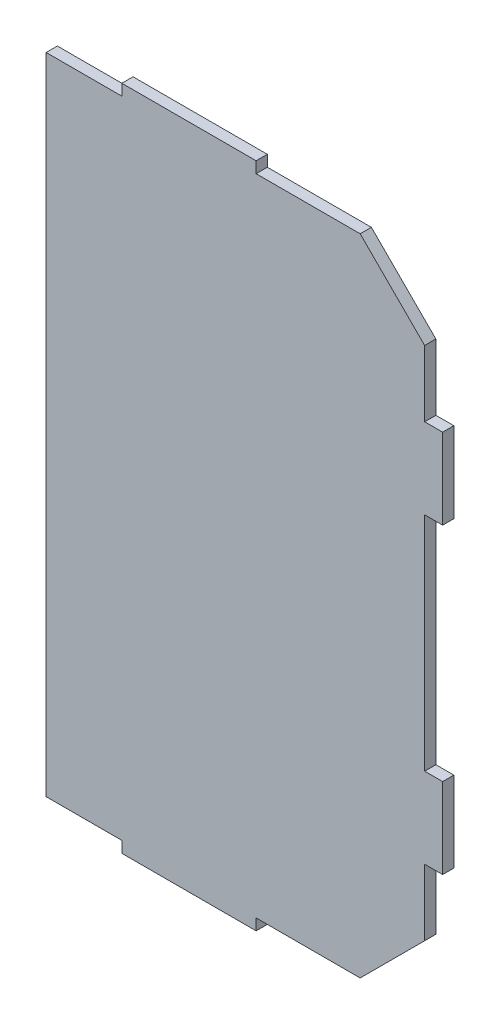
ISO-10303-21;
HEADER;
FILE_DESCRIPTION(('STEP AP214'),'2;1');
FILE_NAME('part.step','',(''),(''),'','','');
FILE_SCHEMA(('AUTOMOTIVE_DESIGN { 1 0 10303 214 1 1 1 1 }'));
ENDSEC;
DATA;
#1=APPLICATION_CONTEXT('core data for automotive mechanical design processes');
#2=APPLICATION_PROTOCOL_DEFINITION('international standard','automotive_design',2000,#1);
#3=PRODUCT_CONTEXT('',#1,'mechanical');
#4=PRODUCT('Part','Part','',(#3));
#5=PRODUCT_RELATED_PRODUCT_CATEGORY('part','',(#4));
#6=PRODUCT_DEFINITION_FORMATION('','',#4);
#7=PRODUCT_DEFINITION_CONTEXT('part definition',#1,'design');
#8=PRODUCT_DEFINITION('design','',#6,#7);
#9=PRODUCT_DEFINITION_SHAPE('','',#8);
#10=(LENGTH_UNIT() NAMED_UNIT(*) SI_UNIT(.MILLI.,.METRE.));
#11=(NAMED_UNIT(*) PLANE_ANGLE_UNIT() SI_UNIT($,.RADIAN.));
#12=(NAMED_UNIT(*) SI_UNIT($,.STERADIAN.) SOLID_ANGLE_UNIT());
#13=UNCERTAINTY_MEASURE_WITH_UNIT(LENGTH_MEASURE(1.E-05),#10,'distance_accuracy_value','');
#14=(GEOMETRIC_REPRESENTATION_CONTEXT(3) GLOBAL_UNCERTAINTY_ASSIGNED_CONTEXT((#13)) GLOBAL_UNIT_ASSIGNED_CONTEXT((#10,
#11,#12)) REPRESENTATION_CONTEXT('',''));
#15=CARTESIAN_POINT('',(0.,0.,0.));
#16=DIRECTION('',(0.,0.,1.));
#17=DIRECTION('',(1.,0.,0.));
#18=AXIS2_PLACEMENT_3D('',#15,#16,#17);
#19=CARTESIAN_POINT('',(-112.431652928551,-181.104658844913,10.6));
#20=DIRECTION('',(-1.,0.,0.));
#21=DIRECTION('',(0.,-1.,0.));
#22=AXIS2_PLACEMENT_3D('',#19,#20,#21);
#23=PLANE('',#22);
#24=DIRECTION('',(0.,1.,0.));
#25=VECTOR('',#24,1.);
#26=CARTESIAN_POINT('',(-112.431652928551,-181.104658844913,0.));
#27=LINE('',#26,#25);
#28=CARTESIAN_POINT('',(-112.431652928551,-243.800878167297,0.));
#29=VERTEX_POINT('',#28);
#30=CARTESIAN_POINT('',(-112.431652928551,-181.104658844913,0.));
#31=VERTEX_POINT('',#30);
#32=EDGE_CURVE('E387',#29,#31,#27,.T.);
#33=ORIENTED_EDGE('',*,*,#32,.T.);
#34=DIRECTION('',(0.,0.,-1.));
#35=VECTOR('',#34,1.);
#36=CARTESIAN_POINT('',(-112.431652928551,-181.104658844913,10.6));
#37=LINE('',#36,#35);
#38=CARTESIAN_POINT('',(-112.431652928551,-181.104658844913,10.6));
#39=VERTEX_POINT('',#38);
#40=EDGE_CURVE('E12',#39,#31,#37,.T.);
#41=ORIENTED_EDGE('',*,*,#40,.F.);
#42=DIRECTION('',(0.,1.,0.));
#43=VECTOR('',#42,1.);
#44=CARTESIAN_POINT('',(-112.431652928551,-181.104658844913,10.6));
#45=LINE('',#44,#43);
#46=CARTESIAN_POINT('',(-112.431652928551,-243.800878167297,10.6));
#47=VERTEX_POINT('',#46);
#48=EDGE_CURVE('E311',#47,#39,#45,.T.);
#49=ORIENTED_EDGE('',*,*,#48,.F.);
#50=DIRECTION('',(0.,0.,-1.));
#51=VECTOR('',#50,1.);
#52=CARTESIAN_POINT('',(-112.431652928551,-243.800878167297,10.6));
#53=LINE('',#52,#51);
#54=EDGE_CURVE('E219',#47,#29,#53,.T.);
#55=ORIENTED_EDGE('',*,*,#54,.T.);
#56=EDGE_LOOP('',(#33,#41,#49,#55));
#57=FACE_BOUND('',#56,.T.);
#58=ADVANCED_FACE('F40',(#57),#23,.F.);
#59=CARTESIAN_POINT('',(-95.4316529285508,-181.104658844913,10.6));
#60=DIRECTION('',(0.,1.,0.));
#61=DIRECTION('',(0.,0.,1.));
#62=AXIS2_PLACEMENT_3D('',#59,#60,#61);
#63=PLANE('',#62);
#64=DIRECTION('',(1.,0.,0.));
#65=VECTOR('',#64,1.);
#66=CARTESIAN_POINT('',(-95.4316529285508,-181.104658844913,0.));
#67=LINE('',#66,#65);
#68=CARTESIAN_POINT('',(-95.4316529285508,-181.104658844913,0.));
#69=VERTEX_POINT('',#68);
#70=EDGE_CURVE('E381',#31,#69,#67,.T.);
#71=ORIENTED_EDGE('',*,*,#70,.T.);
#72=DIRECTION('',(0.,0.,-1.));
#73=VECTOR('',#72,1.);
#74=CARTESIAN_POINT('',(-95.4316529285508,-181.104658844913,10.6));
#75=LINE('',#74,#73);
#76=CARTESIAN_POINT('',(-95.4316529285508,-181.104658844913,10.6));
#77=VERTEX_POINT('',#76);
#78=EDGE_CURVE('E48',#77,#69,#75,.T.);
#79=ORIENTED_EDGE('',*,*,#78,.F.);
#80=DIRECTION('',(1.,0.,0.));
#81=VECTOR('',#80,1.);
#82=CARTESIAN_POINT('',(-95.4316529285508,-181.104658844913,10.6));
#83=LINE('',#82,#81);
#84=EDGE_CURVE('E141',#39,#77,#83,.T.);
#85=ORIENTED_EDGE('',*,*,#84,.F.);
#86=ORIENTED_EDGE('',*,*,#40,.T.);
#87=EDGE_LOOP('',(#71,#79,#85,#86));
#88=FACE_BOUND('',#87,.T.);
#89=ADVANCED_FACE('F436',(#88),#63,.F.);
#90=CARTESIAN_POINT('',(-95.4316529285508,-104.904658844913,10.6));
#91=DIRECTION('',(-1.,0.,0.));
#92=DIRECTION('',(0.,0.,1.));
#93=AXIS2_PLACEMENT_3D('',#90,#91,#92);
#94=PLANE('',#93);
#95=DIRECTION('',(0.,1.,0.));
#96=VECTOR('',#95,1.);
#97=CARTESIAN_POINT('',(-95.4316529285508,-104.904658844913,0.));
#98=LINE('',#97,#96);
#99=CARTESIAN_POINT('',(-95.4316529285508,-104.904658844913,0.));
#100=VERTEX_POINT('',#99);
#101=EDGE_CURVE('E376',#69,#100,#98,.T.);
#102=ORIENTED_EDGE('',*,*,#101,.T.);
#103=DIRECTION('',(0.,0.,-1.));
#104=VECTOR('',#103,1.);
#105=CARTESIAN_POINT('',(-95.4316529285508,-104.904658844913,10.6));
#106=LINE('',#105,#104);
#107=CARTESIAN_POINT('',(-95.4316529285508,-104.904658844913,10.6));
#108=VERTEX_POINT('',#107);
#109=EDGE_CURVE('E368',#108,#100,#106,.T.);
#110=ORIENTED_EDGE('',*,*,#109,.F.);
#111=DIRECTION('',(0.,1.,0.));
#112=VECTOR('',#111,1.);
#113=CARTESIAN_POINT('',(-95.4316529285508,-104.904658844913,10.6));
#114=LINE('',#113,#112);
#115=EDGE_CURVE('E305',#77,#108,#114,.T.);
#116=ORIENTED_EDGE('',*,*,#115,.F.);
#117=ORIENTED_EDGE('',*,*,#78,.T.);
#118=EDGE_LOOP('',(#102,#110,#116,#117));
#119=FACE_BOUND('',#118,.T.);
#120=ADVANCED_FACE('F374',(#119),#94,.F.);
#121=CARTESIAN_POINT('',(-95.4316529285508,-104.904658844913,10.6));
#122=DIRECTION('',(0.,-1.,0.));
#123=DIRECTION('',(1.,0.,0.));
#124=AXIS2_PLACEMENT_3D('',#121,#122,#123);
#125=PLANE('',#124);
#126=DIRECTION('',(-1.,0.,0.));
#127=VECTOR('',#126,1.);
#128=CARTESIAN_POINT('',(-95.4316529285508,-104.904658844913,0.));
#129=LINE('',#128,#127);
#130=CARTESIAN_POINT('',(-112.431652928551,-104.904658844913,0.));
#131=VERTEX_POINT('',#130);
#132=EDGE_CURVE('E383',#100,#131,#129,.T.);
#133=ORIENTED_EDGE('',*,*,#132,.T.);
#134=DIRECTION('',(0.,0.,-1.));
#135=VECTOR('',#134,1.);
#136=CARTESIAN_POINT('',(-112.431652928551,-104.904658844913,10.6));
#137=LINE('',#136,#135);
#138=CARTESIAN_POINT('',(-112.431652928551,-104.904658844913,10.6));
#139=VERTEX_POINT('',#138);
#140=EDGE_CURVE('E365',#139,#131,#137,.T.);
#141=ORIENTED_EDGE('',*,*,#140,.F.);
#142=DIRECTION('',(-1.,0.,0.));
#143=VECTOR('',#142,1.);
#144=CARTESIAN_POINT('',(-95.4316529285508,-104.904658844913,10.6));
#145=LINE('',#144,#143);
#146=EDGE_CURVE('E297',#108,#139,#145,.T.);
#147=ORIENTED_EDGE('',*,*,#146,.F.);
#148=ORIENTED_EDGE('',*,*,#109,.T.);
#149=EDGE_LOOP('',(#133,#141,#147,#148));
#150=FACE_BOUND('',#149,.T.);
#151=ADVANCED_FACE('F443',(#150),#125,.F.);
#152=CARTESIAN_POINT('',(-112.431652928551,105.095341155087,10.6));
#153=DIRECTION('',(-1.,0.,0.));
#154=DIRECTION('',(0.,-1.,0.));
#155=AXIS2_PLACEMENT_3D('',#152,#153,#154);
#156=PLANE('',#155);
#157=DIRECTION('',(0.,1.,0.));
#158=VECTOR('',#157,1.);
#159=CARTESIAN_POINT('',(-112.431652928551,105.095341155087,0.));
#160=LINE('',#159,#158);
#161=CARTESIAN_POINT('',(-112.431652928551,105.095341155087,0.));
#162=VERTEX_POINT('',#161);
#163=EDGE_CURVE('E385',#131,#162,#160,.T.);
#164=ORIENTED_EDGE('',*,*,#163,.T.);
#165=DIRECTION('',(0.,0.,-1.));
#166=VECTOR('',#165,1.);
#167=CARTESIAN_POINT('',(-112.431652928551,105.095341155087,10.6));
#168=LINE('',#167,#166);
#169=CARTESIAN_POINT('',(-112.431652928551,105.095341155087,10.6));
#170=VERTEX_POINT('',#169);
#171=EDGE_CURVE('E362',#170,#162,#168,.T.);
#172=ORIENTED_EDGE('',*,*,#171,.F.);
#173=DIRECTION('',(0.,1.,0.));
#174=VECTOR('',#173,1.);
#175=CARTESIAN_POINT('',(-112.431652928551,105.095341155087,10.6));
#176=LINE('',#175,#174);
#177=EDGE_CURVE('E293',#139,#170,#176,.T.);
#178=ORIENTED_EDGE('',*,*,#177,.F.);
#179=ORIENTED_EDGE('',*,*,#140,.T.);
#180=EDGE_LOOP('',(#164,#172,#178,#179));
#181=FACE_BOUND('',#180,.T.);
#182=ADVANCED_FACE('F448',(#181),#156,.F.);
#183=CARTESIAN_POINT('',(-95.4316529285508,105.095341155087,10.6));
#184=DIRECTION('',(0.,1.,0.));
#185=DIRECTION('',(-1.,0.,0.));
#186=AXIS2_PLACEMENT_3D('',#183,#184,#185);
#187=PLANE('',#186);
#188=DIRECTION('',(1.,0.,0.));
#189=VECTOR('',#188,1.);
#190=CARTESIAN_POINT('',(-95.4316529285508,105.095341155087,0.));
#191=LINE('',#190,#189);
#192=CARTESIAN_POINT('',(-95.4316529285508,105.095341155087,0.));
#193=VERTEX_POINT('',#192);
#194=EDGE_CURVE('E391',#162,#193,#191,.T.);
#195=ORIENTED_EDGE('',*,*,#194,.T.);
#196=DIRECTION('',(0.,0.,-1.));
#197=VECTOR('',#196,1.);
#198=CARTESIAN_POINT('',(-95.4316529285508,105.095341155087,10.6));
#199=LINE('',#198,#197);
#200=CARTESIAN_POINT('',(-95.4316529285508,105.095341155087,10.6));
#201=VERTEX_POINT('',#200);
#202=EDGE_CURVE('E359',#201,#193,#199,.T.);
#203=ORIENTED_EDGE('',*,*,#202,.F.);
#204=DIRECTION('',(1.,0.,0.));
#205=VECTOR('',#204,1.);
#206=CARTESIAN_POINT('',(-95.4316529285508,105.095341155087,10.6));
#207=LINE('',#206,#205);
#208=EDGE_CURVE('E289',#170,#201,#207,.T.);
#209=ORIENTED_EDGE('',*,*,#208,.F.);
#210=ORIENTED_EDGE('',*,*,#171,.T.);
#211=EDGE_LOOP('',(#195,#203,#209,#210));
#212=FACE_BOUND('',#211,.T.);
#213=ADVANCED_FACE('F452',(#212),#187,.F.);
#214=CARTESIAN_POINT('',(-95.4316529285508,181.295341155087,10.6));
#215=DIRECTION('',(-1.,0.,0.));
#216=DIRECTION('',(0.,-1.,0.));
#217=AXIS2_PLACEMENT_3D('',#214,#215,#216);
#218=PLANE('',#217);
#219=DIRECTION('',(0.,1.,0.));
#220=VECTOR('',#219,1.);
#221=CARTESIAN_POINT('',(-95.4316529285508,181.295341155087,0.));
#222=LINE('',#221,#220);
#223=CARTESIAN_POINT('',(-95.4316529285508,181.295341155087,0.));
#224=VERTEX_POINT('',#223);
#225=EDGE_CURVE('E393',#193,#224,#222,.T.);
#226=ORIENTED_EDGE('',*,*,#225,.T.);
#227=DIRECTION('',(0.,0.,-1.));
#228=VECTOR('',#227,1.);
#229=CARTESIAN_POINT('',(-95.4316529285508,181.295341155087,10.6));
#230=LINE('',#229,#228);
#231=CARTESIAN_POINT('',(-95.4316529285508,181.295341155087,10.6));
#232=VERTEX_POINT('',#231);
#233=EDGE_CURVE('E356',#232,#224,#230,.T.);
#234=ORIENTED_EDGE('',*,*,#233,.F.);
#235=DIRECTION('',(0.,1.,0.));
#236=VECTOR('',#235,1.);
#237=CARTESIAN_POINT('',(-95.4316529285508,181.295341155087,10.6));
#238=LINE('',#237,#236);
#239=EDGE_CURVE('E286',#201,#232,#238,.T.);
#240=ORIENTED_EDGE('',*,*,#239,.F.);
#241=ORIENTED_EDGE('',*,*,#202,.T.);
#242=EDGE_LOOP('',(#226,#234,#240,#241));
#243=FACE_BOUND('',#242,.T.);
#244=ADVANCED_FACE('F456',(#243),#218,.F.);
#245=CARTESIAN_POINT('',(-95.4316529285508,181.295341155087,10.6));
#246=DIRECTION('',(0.,-1.,0.));
#247=DIRECTION('',(0.,0.,-1.));
#248=AXIS2_PLACEMENT_3D('',#245,#246,#247);
#249=PLANE('',#248);
#250=DIRECTION('',(-1.,0.,0.));
#251=VECTOR('',#250,1.);
#252=CARTESIAN_POINT('',(-95.4316529285508,181.295341155087,0.));
#253=LINE('',#252,#251);
#254=CARTESIAN_POINT('',(-112.431652928551,181.295341155087,0.));
#255=VERTEX_POINT('',#254);
#256=EDGE_CURVE('E395',#224,#255,#253,.T.);
#257=ORIENTED_EDGE('',*,*,#256,.T.);
#258=DIRECTION('',(0.,0.,-1.));
#259=VECTOR('',#258,1.);
#260=CARTESIAN_POINT('',(-112.431652928551,181.295341155087,10.6));
#261=LINE('',#260,#259);
#262=CARTESIAN_POINT('',(-112.431652928551,181.295341155087,10.6));
#263=VERTEX_POINT('',#262);
#264=EDGE_CURVE('E353',#263,#255,#261,.T.);
#265=ORIENTED_EDGE('',*,*,#264,.F.);
#266=DIRECTION('',(-1.,0.,0.));
#267=VECTOR('',#266,1.);
#268=CARTESIAN_POINT('',(-95.4316529285508,181.295341155087,10.6));
#269=LINE('',#268,#267);
#270=EDGE_CURVE('E278',#232,#263,#269,.T.);
#271=ORIENTED_EDGE('',*,*,#270,.F.);
#272=ORIENTED_EDGE('',*,*,#233,.T.);
#273=EDGE_LOOP('',(#257,#265,#271,#272));
#274=FACE_BOUND('',#273,.T.);
#275=ADVANCED_FACE('F460',(#274),#249,.F.);
#276=CARTESIAN_POINT('',(-112.431652928551,243.800878167298,10.6));
#277=DIRECTION('',(-1.,0.,0.));
#278=DIRECTION('',(0.,-1.,0.));
#279=AXIS2_PLACEMENT_3D('',#276,#277,#278);
#280=PLANE('',#279);
#281=DIRECTION('',(0.,1.,0.));
#282=VECTOR('',#281,1.);
#283=CARTESIAN_POINT('',(-112.431652928551,243.800878167298,0.));
#284=LINE('',#283,#282);
#285=CARTESIAN_POINT('',(-112.431652928551,243.800878167298,0.));
#286=VERTEX_POINT('',#285);
#287=EDGE_CURVE('E397',#255,#286,#284,.T.);
#288=ORIENTED_EDGE('',*,*,#287,.T.);
#289=DIRECTION('',(0.,0.,-1.));
#290=VECTOR('',#289,1.);
#291=CARTESIAN_POINT('',(-112.431652928551,243.800878167298,10.6));
#292=LINE('',#291,#290);
#293=CARTESIAN_POINT('',(-112.431652928551,243.800878167298,10.6));
#294=VERTEX_POINT('',#293);
#295=EDGE_CURVE('E350',#294,#286,#292,.T.);
#296=ORIENTED_EDGE('',*,*,#295,.F.);
#297=DIRECTION('',(0.,1.,0.));
#298=VECTOR('',#297,1.);
#299=CARTESIAN_POINT('',(-112.431652928551,243.800878167298,10.6));
#300=LINE('',#299,#298);
#301=EDGE_CURVE('E274',#263,#294,#300,.T.);
#302=ORIENTED_EDGE('',*,*,#301,.F.);
#303=ORIENTED_EDGE('',*,*,#264,.T.);
#304=EDGE_LOOP('',(#288,#296,#302,#303));
#305=FACE_BOUND('',#304,.T.);
#306=ADVANCED_FACE('F464',(#305),#280,.F.);
#307=CARTESIAN_POINT('',(-173.430774761253,304.8,10.6));
#308=DIRECTION('',(-0.707106781186547,-0.707106781186548,0.));
#309=DIRECTION('',(0.707106781186548,-0.707106781186547,0.));
#310=AXIS2_PLACEMENT_3D('',#307,#308,#309);
#311=PLANE('',#310);
#312=DIRECTION('',(-0.707106781186548,0.707106781186547,0.));
#313=VECTOR('',#312,1.);
#314=CARTESIAN_POINT('',(-173.430774761253,304.8,0.));
#315=LINE('',#314,#313);
#316=CARTESIAN_POINT('',(-173.430774761253,304.8,0.));
#317=VERTEX_POINT('',#316);
#318=EDGE_CURVE('E399',#286,#317,#315,.T.);
#319=ORIENTED_EDGE('',*,*,#318,.T.);
#320=DIRECTION('',(0.,0.,-1.));
#321=VECTOR('',#320,1.);
#322=CARTESIAN_POINT('',(-173.430774761253,304.8,10.6));
#323=LINE('',#322,#321);
#324=CARTESIAN_POINT('',(-173.430774761253,304.8,10.6));
#325=VERTEX_POINT('',#324);
#326=EDGE_CURVE('E347',#325,#317,#323,.T.);
#327=ORIENTED_EDGE('',*,*,#326,.F.);
#328=DIRECTION('',(-0.707106781186548,0.707106781186547,0.));
#329=VECTOR('',#328,1.);
#330=CARTESIAN_POINT('',(-173.430774761253,304.8,10.6));
#331=LINE('',#330,#329);
#332=EDGE_CURVE('E270',#294,#325,#331,.T.);
#333=ORIENTED_EDGE('',*,*,#332,.F.);
#334=ORIENTED_EDGE('',*,*,#295,.T.);
#335=EDGE_LOOP('',(#319,#327,#333,#334));
#336=FACE_BOUND('',#335,.T.);
#337=ADVANCED_FACE('F468',(#336),#311,.F.);
#338=CARTESIAN_POINT('',(-173.430774761253,304.8,10.6));
#339=DIRECTION('',(0.,-1.,0.));
#340=DIRECTION('',(1.,0.,0.));
#341=AXIS2_PLACEMENT_3D('',#338,#339,#340);
#342=PLANE('',#341);
#343=DIRECTION('',(-1.,0.,0.));
#344=VECTOR('',#343,1.);
#345=CARTESIAN_POINT('',(-173.430774761253,304.8,0.));
#346=LINE('',#345,#344);
#347=CARTESIAN_POINT('',(-271.838092179976,304.800000000001,0.));
#348=VERTEX_POINT('',#347);
#349=EDGE_CURVE('E401',#317,#348,#346,.T.);
#350=ORIENTED_EDGE('',*,*,#349,.T.);
#351=DIRECTION('',(0.,0.,-1.));
#352=VECTOR('',#351,1.);
#353=CARTESIAN_POINT('',(-271.838092179976,304.800000000001,10.6));
#354=LINE('',#353,#352);
#355=CARTESIAN_POINT('',(-271.838092179976,304.800000000001,10.6));
#356=VERTEX_POINT('',#355);
#357=EDGE_CURVE('E344',#356,#348,#354,.T.);
#358=ORIENTED_EDGE('',*,*,#357,.F.);
#359=DIRECTION('',(-1.,0.,0.));
#360=VECTOR('',#359,1.);
#361=CARTESIAN_POINT('',(-173.430774761253,304.8,10.6));
#362=LINE('',#361,#360);
#363=EDGE_CURVE('E267',#325,#356,#362,.T.);
#364=ORIENTED_EDGE('',*,*,#363,.F.);
#365=ORIENTED_EDGE('',*,*,#326,.T.);
#366=EDGE_LOOP('',(#350,#358,#364,#365));
#367=FACE_BOUND('',#366,.T.);
#368=ADVANCED_FACE('F472',(#367),#342,.F.);
#369=CARTESIAN_POINT('',(-271.838092179976,304.800000000001,10.6));
#370=DIRECTION('',(-1.,0.,0.));
#371=DIRECTION('',(0.,0.,1.));
#372=AXIS2_PLACEMENT_3D('',#369,#370,#371);
#373=PLANE('',#372);
#374=DIRECTION('',(0.,1.,0.));
#375=VECTOR('',#374,1.);
#376=CARTESIAN_POINT('',(-271.838092179976,304.800000000001,0.));
#377=LINE('',#376,#375);
#378=CARTESIAN_POINT('',(-271.838092179976,315.4,0.));
#379=VERTEX_POINT('',#378);
#380=EDGE_CURVE('E403',#348,#379,#377,.T.);
#381=ORIENTED_EDGE('',*,*,#380,.T.);
#382=DIRECTION('',(0.,0.,-1.));
#383=VECTOR('',#382,1.);
#384=CARTESIAN_POINT('',(-271.838092179976,315.4,10.6));
#385=LINE('',#384,#383);
#386=CARTESIAN_POINT('',(-271.838092179976,315.4,10.6));
#387=VERTEX_POINT('',#386);
#388=EDGE_CURVE('E341',#387,#379,#385,.T.);
#389=ORIENTED_EDGE('',*,*,#388,.F.);
#390=DIRECTION('',(0.,1.,0.));
#391=VECTOR('',#390,1.);
#392=CARTESIAN_POINT('',(-271.838092179976,304.800000000001,10.6));
#393=LINE('',#392,#391);
#394=EDGE_CURVE('E259',#356,#387,#393,.T.);
#395=ORIENTED_EDGE('',*,*,#394,.F.);
#396=ORIENTED_EDGE('',*,*,#357,.T.);
#397=EDGE_LOOP('',(#381,#389,#395,#396));
#398=FACE_BOUND('',#397,.T.);
#399=ADVANCED_FACE('F476',(#398),#373,.F.);
#400=CARTESIAN_POINT('',(-398.838092179976,315.4,10.6));
#401=DIRECTION('',(0.,-1.,0.));
#402=DIRECTION('',(0.,0.,-1.));
#403=AXIS2_PLACEMENT_3D('',#400,#401,#402);
#404=PLANE('',#403);
#405=DIRECTION('',(-1.,0.,0.));
#406=VECTOR('',#405,1.);
#407=CARTESIAN_POINT('',(-398.838092179976,315.4,0.));
#408=LINE('',#407,#406);
#409=CARTESIAN_POINT('',(-398.838092179976,315.4,0.));
#410=VERTEX_POINT('',#409);
#411=EDGE_CURVE('E405',#379,#410,#408,.T.);
#412=ORIENTED_EDGE('',*,*,#411,.T.);
#413=DIRECTION('',(0.,0.,-1.));
#414=VECTOR('',#413,1.);
#415=CARTESIAN_POINT('',(-398.838092179976,315.4,10.6));
#416=LINE('',#415,#414);
#417=CARTESIAN_POINT('',(-398.838092179976,315.4,10.6));
#418=VERTEX_POINT('',#417);
#419=EDGE_CURVE('E338',#418,#410,#416,.T.);
#420=ORIENTED_EDGE('',*,*,#419,.F.);
#421=DIRECTION('',(-1.,0.,0.));
#422=VECTOR('',#421,1.);
#423=CARTESIAN_POINT('',(-398.838092179976,315.4,10.6));
#424=LINE('',#423,#422);
#425=EDGE_CURVE('E255',#387,#418,#424,.T.);
#426=ORIENTED_EDGE('',*,*,#425,.F.);
#427=ORIENTED_EDGE('',*,*,#388,.T.);
#428=EDGE_LOOP('',(#412,#420,#426,#427));
#429=FACE_BOUND('',#428,.T.);
#430=ADVANCED_FACE('F480',(#429),#404,.F.);
#431=CARTESIAN_POINT('',(-398.838092179976,304.8,10.6));
#432=DIRECTION('',(1.,0.,0.));
#433=DIRECTION('',(0.,0.,-1.));
#434=AXIS2_PLACEMENT_3D('',#431,#432,#433);
#435=PLANE('',#434);
#436=DIRECTION('',(0.,-1.,0.));
#437=VECTOR('',#436,1.);
#438=CARTESIAN_POINT('',(-398.838092179976,304.8,0.));
#439=LINE('',#438,#437);
#440=CARTESIAN_POINT('',(-398.838092179976,304.8,0.));
#441=VERTEX_POINT('',#440);
#442=EDGE_CURVE('E407',#410,#441,#439,.T.);
#443=ORIENTED_EDGE('',*,*,#442,.T.);
#444=DIRECTION('',(0.,0.,-1.));
#445=VECTOR('',#444,1.);
#446=CARTESIAN_POINT('',(-398.838092179976,304.8,10.6));
#447=LINE('',#446,#445);
#448=CARTESIAN_POINT('',(-398.838092179976,304.8,10.6));
#449=VERTEX_POINT('',#448);
#450=EDGE_CURVE('E335',#449,#441,#447,.T.);
#451=ORIENTED_EDGE('',*,*,#450,.F.);
#452=DIRECTION('',(0.,-1.,0.));
#453=VECTOR('',#452,1.);
#454=CARTESIAN_POINT('',(-398.838092179976,304.8,10.6));
#455=LINE('',#454,#453);
#456=EDGE_CURVE('E251',#418,#449,#455,.T.);
#457=ORIENTED_EDGE('',*,*,#456,.F.);
#458=ORIENTED_EDGE('',*,*,#419,.T.);
#459=EDGE_LOOP('',(#443,#451,#457,#458));
#460=FACE_BOUND('',#459,.T.);
#461=ADVANCED_FACE('F484',(#460),#435,.F.);
#462=CARTESIAN_POINT('',(-398.838092179976,304.8,10.6));
#463=DIRECTION('',(0.,-1.,0.));
#464=DIRECTION('',(0.,0.,-1.));
#465=AXIS2_PLACEMENT_3D('',#462,#463,#464);
#466=PLANE('',#465);
#467=DIRECTION('',(-1.,0.,0.));
#468=VECTOR('',#467,1.);
#469=CARTESIAN_POINT('',(-398.838092179976,304.8,0.));
#470=LINE('',#469,#468);
#471=CARTESIAN_POINT('',(-470.431652928551,304.8,0.));
#472=VERTEX_POINT('',#471);
#473=EDGE_CURVE('E409',#441,#472,#470,.T.);
#474=ORIENTED_EDGE('',*,*,#473,.T.);
#475=DIRECTION('',(0.,0.,-1.));
#476=VECTOR('',#475,1.);
#477=CARTESIAN_POINT('',(-470.431652928551,304.8,10.6));
#478=LINE('',#477,#476);
#479=CARTESIAN_POINT('',(-470.431652928551,304.8,10.6));
#480=VERTEX_POINT('',#479);
#481=EDGE_CURVE('E332',#480,#472,#478,.T.);
#482=ORIENTED_EDGE('',*,*,#481,.F.);
#483=DIRECTION('',(-1.,0.,0.));
#484=VECTOR('',#483,1.);
#485=CARTESIAN_POINT('',(-398.838092179976,304.8,10.6));
#486=LINE('',#485,#484);
#487=EDGE_CURVE('E248',#449,#480,#486,.T.);
#488=ORIENTED_EDGE('',*,*,#487,.F.);
#489=ORIENTED_EDGE('',*,*,#450,.T.);
#490=EDGE_LOOP('',(#474,#482,#488,#489));
#491=FACE_BOUND('',#490,.T.);
#492=ADVANCED_FACE('F488',(#491),#466,.F.);
#493=CARTESIAN_POINT('',(-470.431652928551,304.8,10.6));
#494=DIRECTION('',(1.,0.,0.));
#495=DIRECTION('',(0.,1.,0.));
#496=AXIS2_PLACEMENT_3D('',#493,#494,#495);
#497=PLANE('',#496);
#498=DIRECTION('',(0.,-1.,0.));
#499=VECTOR('',#498,1.);
#500=CARTESIAN_POINT('',(-470.431652928551,304.8,0.));
#501=LINE('',#500,#499);
#502=CARTESIAN_POINT('',(-470.431652928551,-304.8,0.));
#503=VERTEX_POINT('',#502);
#504=EDGE_CURVE('E411',#472,#503,#501,.T.);
#505=ORIENTED_EDGE('',*,*,#504,.T.);
#506=DIRECTION('',(0.,0.,-1.));
#507=VECTOR('',#506,1.);
#508=CARTESIAN_POINT('',(-470.431652928551,-304.8,10.6));
#509=LINE('',#508,#507);
#510=CARTESIAN_POINT('',(-470.431652928551,-304.8,10.6));
#511=VERTEX_POINT('',#510);
#512=EDGE_CURVE('E329',#511,#503,#509,.T.);
#513=ORIENTED_EDGE('',*,*,#512,.F.);
#514=DIRECTION('',(0.,-1.,0.));
#515=VECTOR('',#514,1.);
#516=CARTESIAN_POINT('',(-470.431652928551,304.8,10.6));
#517=LINE('',#516,#515);
#518=EDGE_CURVE('E240',#480,#511,#517,.T.);
#519=ORIENTED_EDGE('',*,*,#518,.F.);
#520=ORIENTED_EDGE('',*,*,#481,.T.);
#521=EDGE_LOOP('',(#505,#513,#519,#520));
#522=FACE_BOUND('',#521,.T.);
#523=ADVANCED_FACE('F492',(#522),#497,.F.);
#524=CARTESIAN_POINT('',(-470.431652928551,-304.8,10.6));
#525=DIRECTION('',(0.,1.,0.));
#526=DIRECTION('',(0.,0.,1.));
#527=AXIS2_PLACEMENT_3D('',#524,#525,#526);
#528=PLANE('',#527);
#529=DIRECTION('',(1.,0.,0.));
#530=VECTOR('',#529,1.);
#531=CARTESIAN_POINT('',(-470.431652928551,-304.8,0.));
#532=LINE('',#531,#530);
#533=CARTESIAN_POINT('',(-398.838092179976,-304.8,0.));
#534=VERTEX_POINT('',#533);
#535=EDGE_CURVE('E413',#503,#534,#532,.T.);
#536=ORIENTED_EDGE('',*,*,#535,.T.);
#537=DIRECTION('',(0.,0.,-1.));
#538=VECTOR('',#537,1.);
#539=CARTESIAN_POINT('',(-398.838092179976,-304.8,10.6));
#540=LINE('',#539,#538);
#541=CARTESIAN_POINT('',(-398.838092179976,-304.8,10.6));
#542=VERTEX_POINT('',#541);
#543=EDGE_CURVE('E326',#542,#534,#540,.T.);
#544=ORIENTED_EDGE('',*,*,#543,.F.);
#545=DIRECTION('',(1.,0.,0.));
#546=VECTOR('',#545,1.);
#547=CARTESIAN_POINT('',(-470.431652928551,-304.8,10.6));
#548=LINE('',#547,#546);
#549=EDGE_CURVE('E236',#511,#542,#548,.T.);
#550=ORIENTED_EDGE('',*,*,#549,.F.);
#551=ORIENTED_EDGE('',*,*,#512,.T.);
#552=EDGE_LOOP('',(#536,#544,#550,#551));
#553=FACE_BOUND('',#552,.T.);
#554=ADVANCED_FACE('F496',(#553),#528,.F.);
#555=CARTESIAN_POINT('',(-398.838092179976,-315.4,10.6));
#556=DIRECTION('',(1.,0.,0.));
#557=DIRECTION('',(0.,0.,-1.));
#558=AXIS2_PLACEMENT_3D('',#555,#556,#557);
#559=PLANE('',#558);
#560=DIRECTION('',(0.,-1.,0.));
#561=VECTOR('',#560,1.);
#562=CARTESIAN_POINT('',(-398.838092179976,-315.4,0.));
#563=LINE('',#562,#561);
#564=CARTESIAN_POINT('',(-398.838092179976,-315.4,0.));
#565=VERTEX_POINT('',#564);
#566=EDGE_CURVE('E415',#534,#565,#563,.T.);
#567=ORIENTED_EDGE('',*,*,#566,.T.);
#568=DIRECTION('',(0.,0.,-1.));
#569=VECTOR('',#568,1.);
#570=CARTESIAN_POINT('',(-398.838092179976,-315.4,10.6));
#571=LINE('',#570,#569);
#572=CARTESIAN_POINT('',(-398.838092179976,-315.4,10.6));
#573=VERTEX_POINT('',#572);
#574=EDGE_CURVE('E323',#573,#565,#571,.T.);
#575=ORIENTED_EDGE('',*,*,#574,.F.);
#576=DIRECTION('',(0.,-1.,0.));
#577=VECTOR('',#576,1.);
#578=CARTESIAN_POINT('',(-398.838092179976,-315.4,10.6));
#579=LINE('',#578,#577);
#580=EDGE_CURVE('E232',#542,#573,#579,.T.);
#581=ORIENTED_EDGE('',*,*,#580,.F.);
#582=ORIENTED_EDGE('',*,*,#543,.T.);
#583=EDGE_LOOP('',(#567,#575,#581,#582));
#584=FACE_BOUND('',#583,.T.);
#585=ADVANCED_FACE('F500',(#584),#559,.F.);
#586=CARTESIAN_POINT('',(-398.838092179976,-315.4,10.6));
#587=DIRECTION('',(0.,1.,0.));
#588=DIRECTION('',(0.,0.,1.));
#589=AXIS2_PLACEMENT_3D('',#586,#587,#588);
#590=PLANE('',#589);
#591=DIRECTION('',(1.,0.,0.));
#592=VECTOR('',#591,1.);
#593=CARTESIAN_POINT('',(-398.838092179976,-315.4,0.));
#594=LINE('',#593,#592);
#595=CARTESIAN_POINT('',(-271.838092179976,-315.4,0.));
#596=VERTEX_POINT('',#595);
#597=EDGE_CURVE('E417',#565,#596,#594,.T.);
#598=ORIENTED_EDGE('',*,*,#597,.T.);
#599=DIRECTION('',(0.,0.,-1.));
#600=VECTOR('',#599,1.);
#601=CARTESIAN_POINT('',(-271.838092179976,-315.4,10.6));
#602=LINE('',#601,#600);
#603=CARTESIAN_POINT('',(-271.838092179976,-315.4,10.6));
#604=VERTEX_POINT('',#603);
#605=EDGE_CURVE('E212',#604,#596,#602,.T.);
#606=ORIENTED_EDGE('',*,*,#605,.F.);
#607=DIRECTION('',(1.,0.,0.));
#608=VECTOR('',#607,1.);
#609=CARTESIAN_POINT('',(-398.838092179976,-315.4,10.6));
#610=LINE('',#609,#608);
#611=EDGE_CURVE('E202',#573,#604,#610,.T.);
#612=ORIENTED_EDGE('',*,*,#611,.F.);
#613=ORIENTED_EDGE('',*,*,#574,.T.);
#614=EDGE_LOOP('',(#598,#606,#612,#613));
#615=FACE_BOUND('',#614,.T.);
#616=ADVANCED_FACE('F420',(#615),#590,.F.);
#617=CARTESIAN_POINT('',(-271.838092179976,-315.4,10.6));
#618=DIRECTION('',(-1.,0.,0.));
#619=DIRECTION('',(0.,0.,1.));
#620=AXIS2_PLACEMENT_3D('',#617,#618,#619);
#621=PLANE('',#620);
#622=DIRECTION('',(0.,1.,0.));
#623=VECTOR('',#622,1.);
#624=CARTESIAN_POINT('',(-271.838092179976,-315.4,0.));
#625=LINE('',#624,#623);
#626=CARTESIAN_POINT('',(-271.838092179976,-304.8,0.));
#627=VERTEX_POINT('',#626);
#628=EDGE_CURVE('E211',#596,#627,#625,.T.);
#629=ORIENTED_EDGE('',*,*,#628,.T.);
#630=DIRECTION('',(0.,0.,-1.));
#631=VECTOR('',#630,1.);
#632=CARTESIAN_POINT('',(-271.838092179976,-304.8,10.6));
#633=LINE('',#632,#631);
#634=CARTESIAN_POINT('',(-271.838092179976,-304.8,10.6));
#635=VERTEX_POINT('',#634);
#636=EDGE_CURVE('E208',#635,#627,#633,.T.);
#637=ORIENTED_EDGE('',*,*,#636,.F.);
#638=DIRECTION('',(0.,1.,0.));
#639=VECTOR('',#638,1.);
#640=CARTESIAN_POINT('',(-271.838092179976,-315.4,10.6));
#641=LINE('',#640,#639);
#642=EDGE_CURVE('E196',#604,#635,#641,.T.);
#643=ORIENTED_EDGE('',*,*,#642,.F.);
#644=ORIENTED_EDGE('',*,*,#605,.T.);
#645=EDGE_LOOP('',(#629,#637,#643,#644));
#646=FACE_BOUND('',#645,.T.);
#647=ADVANCED_FACE('F209',(#646),#621,.F.);
#648=CARTESIAN_POINT('',(-173.430774761254,-304.8,10.6));
#649=DIRECTION('',(0.,1.,0.));
#650=DIRECTION('',(0.,0.,1.));
#651=AXIS2_PLACEMENT_3D('',#648,#649,#650);
#652=PLANE('',#651);
#653=DIRECTION('',(1.,0.,0.));
#654=VECTOR('',#653,1.);
#655=CARTESIAN_POINT('',(-173.430774761254,-304.8,0.));
#656=LINE('',#655,#654);
#657=CARTESIAN_POINT('',(-173.430774761254,-304.8,0.));
#658=VERTEX_POINT('',#657);
#659=EDGE_CURVE('E127',#627,#658,#656,.T.);
#660=ORIENTED_EDGE('',*,*,#659,.T.);
#661=DIRECTION('',(0.,0.,-1.));
#662=VECTOR('',#661,1.);
#663=CARTESIAN_POINT('',(-173.430774761254,-304.8,10.6));
#664=LINE('',#663,#662);
#665=CARTESIAN_POINT('',(-173.430774761254,-304.8,10.6));
#666=VERTEX_POINT('',#665);
#667=EDGE_CURVE('E213',#666,#658,#664,.T.);
#668=ORIENTED_EDGE('',*,*,#667,.F.);
#669=DIRECTION('',(1.,0.,0.));
#670=VECTOR('',#669,1.);
#671=CARTESIAN_POINT('',(-173.430774761254,-304.8,10.6));
#672=LINE('',#671,#670);
#673=EDGE_CURVE('E200',#635,#666,#672,.T.);
#674=ORIENTED_EDGE('',*,*,#673,.F.);
#675=ORIENTED_EDGE('',*,*,#636,.T.);
#676=EDGE_LOOP('',(#660,#668,#674,#675));
#677=FACE_BOUND('',#676,.T.);
#678=ADVANCED_FACE('F215',(#677),#652,.F.);
#679=CARTESIAN_POINT('',(-173.430774761254,-304.8,10.6));
#680=DIRECTION('',(-0.707106781186549,0.707106781186546,0.));
#681=DIRECTION('',(-0.707106781186546,-0.707106781186549,0.));
#682=AXIS2_PLACEMENT_3D('',#679,#680,#681);
#683=PLANE('',#682);
#684=DIRECTION('',(0.707106781186546,0.707106781186549,0.));
#685=VECTOR('',#684,1.);
#686=CARTESIAN_POINT('',(-173.430774761254,-304.8,0.));
#687=LINE('',#686,#685);
#688=EDGE_CURVE('E133',#658,#29,#687,.T.);
#689=ORIENTED_EDGE('',*,*,#688,.T.);
#690=ORIENTED_EDGE('',*,*,#54,.F.);
#691=DIRECTION('',(0.707106781186546,0.707106781186549,0.));
#692=VECTOR('',#691,1.);
#693=CARTESIAN_POINT('',(-173.430774761254,-304.8,10.6));
#694=LINE('',#693,#692);
#695=EDGE_CURVE('E56',#666,#47,#694,.T.);
#696=ORIENTED_EDGE('',*,*,#695,.F.);
#697=ORIENTED_EDGE('',*,*,#667,.T.);
#698=EDGE_LOOP('',(#689,#690,#696,#697));
#699=FACE_BOUND('',#698,.T.);
#700=ADVANCED_FACE('F425',(#699),#683,.F.);
#701=CARTESIAN_POINT('',(0.,0.,10.6));
#702=DIRECTION('',(0.,0.,-1.));
#703=DIRECTION('',(-1.,0.,0.));
#704=AXIS2_PLACEMENT_3D('',#701,#702,#703);
#705=PLANE('',#704);
#706=ORIENTED_EDGE('',*,*,#48,.T.);
#707=ORIENTED_EDGE('',*,*,#84,.T.);
#708=ORIENTED_EDGE('',*,*,#115,.T.);
#709=ORIENTED_EDGE('',*,*,#146,.T.);
#710=ORIENTED_EDGE('',*,*,#177,.T.);
#711=ORIENTED_EDGE('',*,*,#208,.T.);
#712=ORIENTED_EDGE('',*,*,#239,.T.);
#713=ORIENTED_EDGE('',*,*,#270,.T.);
#714=ORIENTED_EDGE('',*,*,#301,.T.);
#715=ORIENTED_EDGE('',*,*,#332,.T.);
#716=ORIENTED_EDGE('',*,*,#363,.T.);
#717=ORIENTED_EDGE('',*,*,#394,.T.);
#718=ORIENTED_EDGE('',*,*,#425,.T.);
#719=ORIENTED_EDGE('',*,*,#456,.T.);
#720=ORIENTED_EDGE('',*,*,#487,.T.);
#721=ORIENTED_EDGE('',*,*,#518,.T.);
#722=ORIENTED_EDGE('',*,*,#549,.T.);
#723=ORIENTED_EDGE('',*,*,#580,.T.);
#724=ORIENTED_EDGE('',*,*,#611,.T.);
#725=ORIENTED_EDGE('',*,*,#642,.T.);
#726=ORIENTED_EDGE('',*,*,#673,.T.);
#727=ORIENTED_EDGE('',*,*,#695,.T.);
#728=EDGE_LOOP('',(#706,#707,#708,#709,#710,#711,#712,#713,#714,#715,#716,#717,#718,#719,#720,
#721,#722,#723,#724,#725,#726,#727));
#729=FACE_BOUND('',#728,.T.);
#730=ADVANCED_FACE('F198',(#729),#705,.F.);
#731=CARTESIAN_POINT('',(0.,0.,0.));
#732=DIRECTION('',(0.,0.,-1.));
#733=DIRECTION('',(-1.,0.,0.));
#734=AXIS2_PLACEMENT_3D('',#731,#732,#733);
#735=PLANE('',#734);
#736=ORIENTED_EDGE('',*,*,#32,.F.);
#737=ORIENTED_EDGE('',*,*,#688,.F.);
#738=ORIENTED_EDGE('',*,*,#659,.F.);
#739=ORIENTED_EDGE('',*,*,#628,.F.);
#740=ORIENTED_EDGE('',*,*,#597,.F.);
#741=ORIENTED_EDGE('',*,*,#566,.F.);
#742=ORIENTED_EDGE('',*,*,#535,.F.);
#743=ORIENTED_EDGE('',*,*,#504,.F.);
#744=ORIENTED_EDGE('',*,*,#473,.F.);
#745=ORIENTED_EDGE('',*,*,#442,.F.);
#746=ORIENTED_EDGE('',*,*,#411,.F.);
#747=ORIENTED_EDGE('',*,*,#380,.F.);
#748=ORIENTED_EDGE('',*,*,#349,.F.);
#749=ORIENTED_EDGE('',*,*,#318,.F.);
#750=ORIENTED_EDGE('',*,*,#287,.F.);
#751=ORIENTED_EDGE('',*,*,#256,.F.);
#752=ORIENTED_EDGE('',*,*,#225,.F.);
#753=ORIENTED_EDGE('',*,*,#194,.F.);
#754=ORIENTED_EDGE('',*,*,#163,.F.);
#755=ORIENTED_EDGE('',*,*,#132,.F.);
#756=ORIENTED_EDGE('',*,*,#101,.F.);
#757=ORIENTED_EDGE('',*,*,#70,.F.);
#758=EDGE_LOOP('',(#736,#737,#738,#739,#740,#741,#742,#743,#744,#745,#746,#747,#748,#749,#750,
#751,#752,#753,#754,#755,#756,#757));
#759=FACE_BOUND('',#758,.T.);
#760=ADVANCED_FACE('F380',(#759),#735,.T.);
#761=CLOSED_SHELL('',(#58,#89,#120,#151,#182,#213,#244,#275,#306,#337,#368,#399,#430,#461,#492,
#523,#554,#585,#616,#647,#678,#700,#730,#760));
#762=MANIFOLD_SOLID_BREP('B2',#761);
#763=ADVANCED_BREP_SHAPE_REPRESENTATION('',(#18,#762),#14);
#764=SHAPE_DEFINITION_REPRESENTATION(#9,#763);
ENDSEC;
END-ISO-10303-21;
